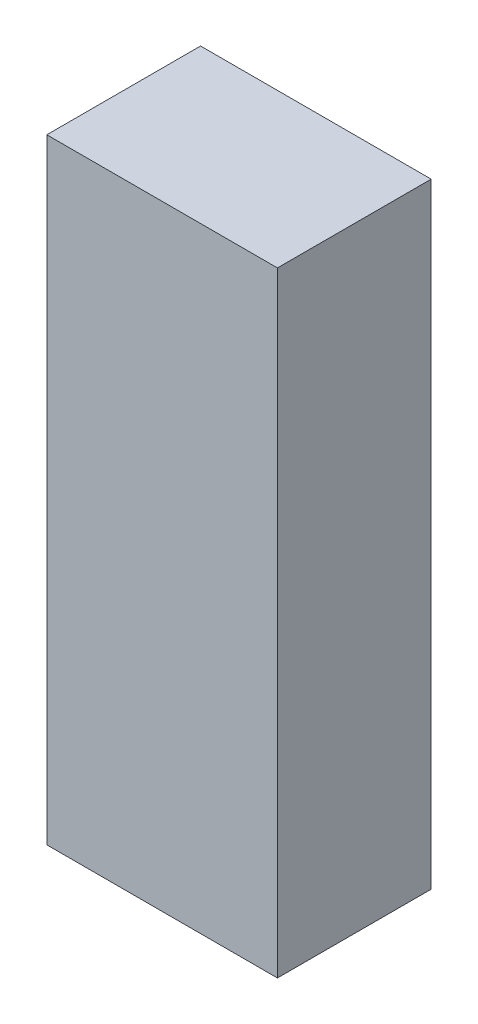
ISO-10303-21;
HEADER;
FILE_DESCRIPTION(('STEP AP214'),'2;1');
FILE_NAME('part.step','',(''),(''),'','','');
FILE_SCHEMA(('AUTOMOTIVE_DESIGN { 1 0 10303 214 1 1 1 1 }'));
ENDSEC;
DATA;
#1=APPLICATION_CONTEXT('core data for automotive mechanical design processes');
#2=APPLICATION_PROTOCOL_DEFINITION('international standard','automotive_design',2000,#1);
#3=PRODUCT_CONTEXT('',#1,'mechanical');
#4=PRODUCT('Part','Part','',(#3));
#5=PRODUCT_RELATED_PRODUCT_CATEGORY('part','',(#4));
#6=PRODUCT_DEFINITION_FORMATION('','',#4);
#7=PRODUCT_DEFINITION_CONTEXT('part definition',#1,'design');
#8=PRODUCT_DEFINITION('design','',#6,#7);
#9=PRODUCT_DEFINITION_SHAPE('','',#8);
#10=(LENGTH_UNIT() NAMED_UNIT(*) SI_UNIT(.MILLI.,.METRE.));
#11=(NAMED_UNIT(*) PLANE_ANGLE_UNIT() SI_UNIT($,.RADIAN.));
#12=(NAMED_UNIT(*) SI_UNIT($,.STERADIAN.) SOLID_ANGLE_UNIT());
#13=UNCERTAINTY_MEASURE_WITH_UNIT(LENGTH_MEASURE(1.E-05),#10,'distance_accuracy_value','');
#14=(GEOMETRIC_REPRESENTATION_CONTEXT(3) GLOBAL_UNCERTAINTY_ASSIGNED_CONTEXT((#13)) GLOBAL_UNIT_ASSIGNED_CONTEXT((#10,
#11,#12)) REPRESENTATION_CONTEXT('',''));
#15=CARTESIAN_POINT('',(0.,0.,0.));
#16=DIRECTION('',(0.,0.,1.));
#17=DIRECTION('',(1.,0.,0.));
#18=AXIS2_PLACEMENT_3D('',#15,#16,#17);
#19=CARTESIAN_POINT('',(0.,0.,10.));
#20=DIRECTION('',(1.,0.,0.));
#21=DIRECTION('',(0.,0.,-1.));
#22=AXIS2_PLACEMENT_3D('',#19,#20,#21);
#23=PLANE('',#22);
#24=DIRECTION('',(0.,-1.,0.));
#25=VECTOR('',#24,1.);
#26=CARTESIAN_POINT('',(0.,0.,0.));
#27=LINE('',#26,#25);
#28=CARTESIAN_POINT('',(0.,40.,0.));
#29=VERTEX_POINT('',#28);
#30=CARTESIAN_POINT('',(0.,0.,0.));
#31=VERTEX_POINT('',#30);
#32=EDGE_CURVE('E107',#29,#31,#27,.T.);
#33=ORIENTED_EDGE('',*,*,#32,.T.);
#34=DIRECTION('',(0.,0.,-1.));
#35=VECTOR('',#34,1.);
#36=CARTESIAN_POINT('',(0.,0.,10.));
#37=LINE('',#36,#35);
#38=CARTESIAN_POINT('',(0.,0.,10.));
#39=VERTEX_POINT('',#38);
#40=EDGE_CURVE('E11',#39,#31,#37,.T.);
#41=ORIENTED_EDGE('',*,*,#40,.F.);
#42=DIRECTION('',(0.,-1.,0.));
#43=VECTOR('',#42,1.);
#44=CARTESIAN_POINT('',(0.,0.,10.));
#45=LINE('',#44,#43);
#46=CARTESIAN_POINT('',(0.,40.,10.));
#47=VERTEX_POINT('',#46);
#48=EDGE_CURVE('E91',#47,#39,#45,.T.);
#49=ORIENTED_EDGE('',*,*,#48,.F.);
#50=DIRECTION('',(0.,0.,-1.));
#51=VECTOR('',#50,1.);
#52=CARTESIAN_POINT('',(0.,40.,10.));
#53=LINE('',#52,#51);
#54=EDGE_CURVE('E103',#47,#29,#53,.T.);
#55=ORIENTED_EDGE('',*,*,#54,.T.);
#56=EDGE_LOOP('',(#33,#41,#49,#55));
#57=FACE_BOUND('',#56,.T.);
#58=ADVANCED_FACE('F39',(#57),#23,.F.);
#59=CARTESIAN_POINT('',(0.,0.,10.));
#60=DIRECTION('',(0.,1.,0.));
#61=DIRECTION('',(0.,0.,1.));
#62=AXIS2_PLACEMENT_3D('',#59,#60,#61);
#63=PLANE('',#62);
#64=DIRECTION('',(1.,0.,0.));
#65=VECTOR('',#64,1.);
#66=CARTESIAN_POINT('',(0.,0.,0.));
#67=LINE('',#66,#65);
#68=CARTESIAN_POINT('',(15.,0.,0.));
#69=VERTEX_POINT('',#68);
#70=EDGE_CURVE('E96',#31,#69,#67,.T.);
#71=ORIENTED_EDGE('',*,*,#70,.T.);
#72=DIRECTION('',(0.,0.,-1.));
#73=VECTOR('',#72,1.);
#74=CARTESIAN_POINT('',(15.,0.,10.));
#75=LINE('',#74,#73);
#76=CARTESIAN_POINT('',(15.,0.,10.));
#77=VERTEX_POINT('',#76);
#78=EDGE_CURVE('E48',#77,#69,#75,.T.);
#79=ORIENTED_EDGE('',*,*,#78,.F.);
#80=DIRECTION('',(1.,0.,0.));
#81=VECTOR('',#80,1.);
#82=CARTESIAN_POINT('',(0.,0.,10.));
#83=LINE('',#82,#81);
#84=EDGE_CURVE('E86',#39,#77,#83,.T.);
#85=ORIENTED_EDGE('',*,*,#84,.F.);
#86=ORIENTED_EDGE('',*,*,#40,.T.);
#87=EDGE_LOOP('',(#71,#79,#85,#86));
#88=FACE_BOUND('',#87,.T.);
#89=ADVANCED_FACE('F95',(#88),#63,.F.);
#90=CARTESIAN_POINT('',(15.,0.,10.));
#91=DIRECTION('',(-1.,0.,0.));
#92=DIRECTION('',(0.,0.,1.));
#93=AXIS2_PLACEMENT_3D('',#90,#91,#92);
#94=PLANE('',#93);
#95=DIRECTION('',(0.,1.,0.));
#96=VECTOR('',#95,1.);
#97=CARTESIAN_POINT('',(15.,0.,0.));
#98=LINE('',#97,#96);
#99=CARTESIAN_POINT('',(15.,40.,0.));
#100=VERTEX_POINT('',#99);
#101=EDGE_CURVE('E73',#69,#100,#98,.T.);
#102=ORIENTED_EDGE('',*,*,#101,.T.);
#103=DIRECTION('',(0.,0.,-1.));
#104=VECTOR('',#103,1.);
#105=CARTESIAN_POINT('',(15.,40.,10.));
#106=LINE('',#105,#104);
#107=CARTESIAN_POINT('',(15.,40.,10.));
#108=VERTEX_POINT('',#107);
#109=EDGE_CURVE('E98',#108,#100,#106,.T.);
#110=ORIENTED_EDGE('',*,*,#109,.F.);
#111=DIRECTION('',(0.,1.,0.));
#112=VECTOR('',#111,1.);
#113=CARTESIAN_POINT('',(15.,0.,10.));
#114=LINE('',#113,#112);
#115=EDGE_CURVE('E89',#77,#108,#114,.T.);
#116=ORIENTED_EDGE('',*,*,#115,.F.);
#117=ORIENTED_EDGE('',*,*,#78,.T.);
#118=EDGE_LOOP('',(#102,#110,#116,#117));
#119=FACE_BOUND('',#118,.T.);
#120=ADVANCED_FACE('F99',(#119),#94,.F.);
#121=CARTESIAN_POINT('',(0.,40.,10.));
#122=DIRECTION('',(0.,-1.,0.));
#123=DIRECTION('',(0.,0.,-1.));
#124=AXIS2_PLACEMENT_3D('',#121,#122,#123);
#125=PLANE('',#124);
#126=DIRECTION('',(-1.,0.,0.));
#127=VECTOR('',#126,1.);
#128=CARTESIAN_POINT('',(0.,40.,0.));
#129=LINE('',#128,#127);
#130=EDGE_CURVE('E79',#100,#29,#129,.T.);
#131=ORIENTED_EDGE('',*,*,#130,.T.);
#132=ORIENTED_EDGE('',*,*,#54,.F.);
#133=DIRECTION('',(-1.,0.,0.));
#134=VECTOR('',#133,1.);
#135=CARTESIAN_POINT('',(0.,40.,10.));
#136=LINE('',#135,#134);
#137=EDGE_CURVE('E56',#108,#47,#136,.T.);
#138=ORIENTED_EDGE('',*,*,#137,.F.);
#139=ORIENTED_EDGE('',*,*,#109,.T.);
#140=EDGE_LOOP('',(#131,#132,#138,#139));
#141=FACE_BOUND('',#140,.T.);
#142=ADVANCED_FACE('F120',(#141),#125,.F.);
#143=CARTESIAN_POINT('',(0.,0.,10.));
#144=DIRECTION('',(0.,0.,-1.));
#145=DIRECTION('',(-1.,0.,0.));
#146=AXIS2_PLACEMENT_3D('',#143,#144,#145);
#147=PLANE('',#146);
#148=ORIENTED_EDGE('',*,*,#48,.T.);
#149=ORIENTED_EDGE('',*,*,#84,.T.);
#150=ORIENTED_EDGE('',*,*,#115,.T.);
#151=ORIENTED_EDGE('',*,*,#137,.T.);
#152=EDGE_LOOP('',(#148,#149,#150,#151));
#153=FACE_BOUND('',#152,.T.);
#154=ADVANCED_FACE('F87',(#153),#147,.F.);
#155=CARTESIAN_POINT('',(0.,0.,0.));
#156=DIRECTION('',(0.,0.,-1.));
#157=DIRECTION('',(-1.,0.,0.));
#158=AXIS2_PLACEMENT_3D('',#155,#156,#157);
#159=PLANE('',#158);
#160=ORIENTED_EDGE('',*,*,#32,.F.);
#161=ORIENTED_EDGE('',*,*,#130,.F.);
#162=ORIENTED_EDGE('',*,*,#101,.F.);
#163=ORIENTED_EDGE('',*,*,#70,.F.);
#164=EDGE_LOOP('',(#160,#161,#162,#163));
#165=FACE_BOUND('',#164,.T.);
#166=ADVANCED_FACE('F123',(#165),#159,.T.);
#167=CLOSED_SHELL('',(#58,#89,#120,#142,#154,#166));
#168=MANIFOLD_SOLID_BREP('B2',#167);
#169=ADVANCED_BREP_SHAPE_REPRESENTATION('',(#18,#168),#14);
#170=SHAPE_DEFINITION_REPRESENTATION(#9,#169);
ENDSEC;
END-ISO-10303-21;
